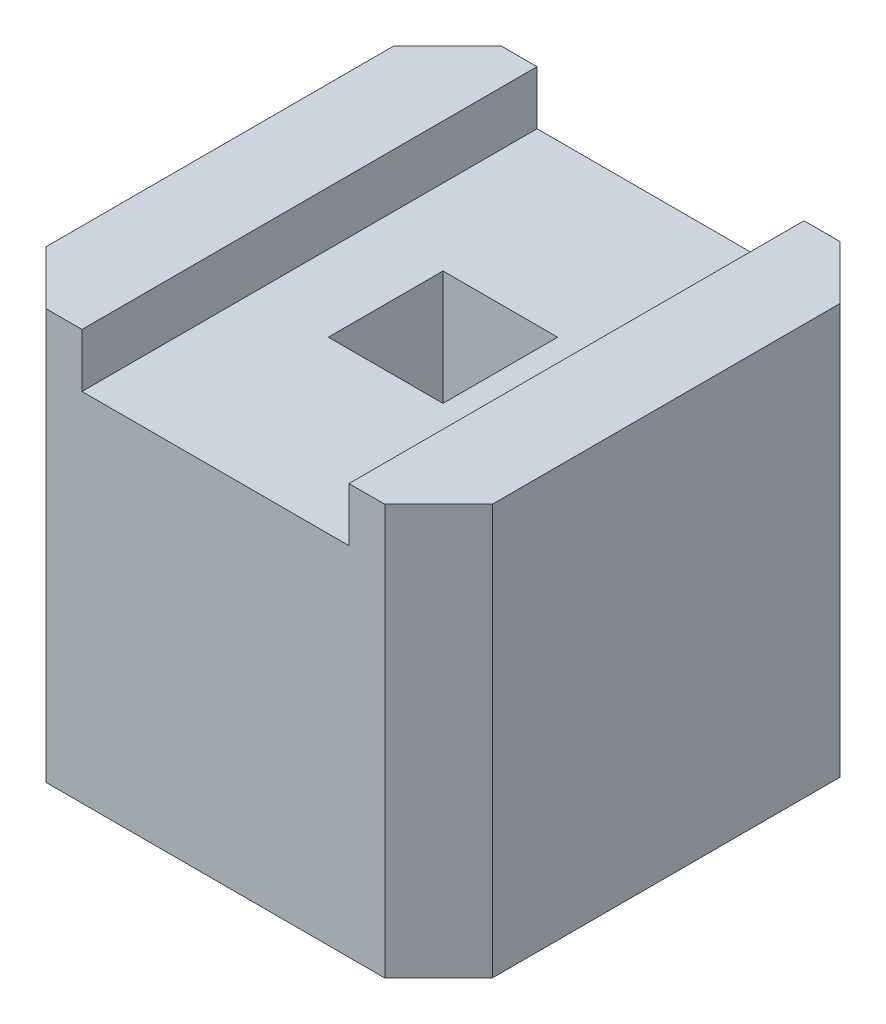
ISO-10303-21;
HEADER;
FILE_DESCRIPTION(('STEP AP214'),'2;1');
FILE_NAME('part.step','',(''),(''),'','','');
FILE_SCHEMA(('AUTOMOTIVE_DESIGN { 1 0 10303 214 1 1 1 1 }'));
ENDSEC;
DATA;
#1=APPLICATION_CONTEXT('core data for automotive mechanical design processes');
#2=APPLICATION_PROTOCOL_DEFINITION('international standard','automotive_design',2000,#1);
#3=PRODUCT_CONTEXT('',#1,'mechanical');
#4=PRODUCT('Part','Part','',(#3));
#5=PRODUCT_RELATED_PRODUCT_CATEGORY('part','',(#4));
#6=PRODUCT_DEFINITION_FORMATION('','',#4);
#7=PRODUCT_DEFINITION_CONTEXT('part definition',#1,'design');
#8=PRODUCT_DEFINITION('design','',#6,#7);
#9=PRODUCT_DEFINITION_SHAPE('','',#8);
#10=(LENGTH_UNIT() NAMED_UNIT(*) SI_UNIT(.MILLI.,.METRE.));
#11=(NAMED_UNIT(*) PLANE_ANGLE_UNIT() SI_UNIT($,.RADIAN.));
#12=(NAMED_UNIT(*) SI_UNIT($,.STERADIAN.) SOLID_ANGLE_UNIT());
#13=UNCERTAINTY_MEASURE_WITH_UNIT(LENGTH_MEASURE(1.E-05),#10,'distance_accuracy_value','');
#14=(GEOMETRIC_REPRESENTATION_CONTEXT(3) GLOBAL_UNCERTAINTY_ASSIGNED_CONTEXT((#13)) GLOBAL_UNIT_ASSIGNED_CONTEXT((#10,
#11,#12)) REPRESENTATION_CONTEXT('',''));
#15=CARTESIAN_POINT('',(0.,0.,0.));
#16=DIRECTION('',(0.,0.,1.));
#17=DIRECTION('',(1.,0.,0.));
#18=AXIS2_PLACEMENT_3D('',#15,#16,#17);
#19=CARTESIAN_POINT('',(-7.21519999999999,-2.4901999568462,8.63));
#20=DIRECTION('',(0.,0.,1.));
#21=DIRECTION('',(1.,0.,0.));
#22=AXIS2_PLACEMENT_3D('',#19,#20,#21);
#23=PLANE('',#22);
#24=DIRECTION('',(0.,1.,0.));
#25=VECTOR('',#24,1.);
#26=CARTESIAN_POINT('',(-5.90999999999999,-0.0998000169278002,8.63));
#27=LINE('',#26,#25);
#28=CARTESIAN_POINT('',(-5.90999999999999,-0.300000011921,8.63));
#29=VERTEX_POINT('',#28);
#30=CARTESIAN_POINT('',(-5.90999999999999,-2.289999961853,8.63));
#31=VERTEX_POINT('',#30);
#32=EDGE_CURVE('E165',#29,#31,#27,.F.);
#33=ORIENTED_EDGE('',*,*,#32,.F.);
#34=DIRECTION('',(1.,0.,0.));
#35=VECTOR('',#34,1.);
#36=CARTESIAN_POINT('',(-7.21519999999999,-0.300000011921,8.63));
#37=LINE('',#36,#35);
#38=CARTESIAN_POINT('',(-6.54999999999999,-0.300000011921,8.63));
#39=VERTEX_POINT('',#38);
#40=EDGE_CURVE('E140',#29,#39,#37,.F.);
#41=ORIENTED_EDGE('',*,*,#40,.T.);
#42=DIRECTION('',(0.,1.,0.));
#43=VECTOR('',#42,1.);
#44=CARTESIAN_POINT('',(-6.54999999999999,-2.4901999568462,8.63));
#45=LINE('',#44,#43);
#46=CARTESIAN_POINT('',(-6.54999999999999,-2.289999961853,8.63));
#47=VERTEX_POINT('',#46);
#48=EDGE_CURVE('E167',#47,#39,#45,.T.);
#49=ORIENTED_EDGE('',*,*,#48,.F.);
#50=DIRECTION('',(1.,0.,0.));
#51=VECTOR('',#50,1.);
#52=CARTESIAN_POINT('',(-7.21519999999999,-2.289999961853,8.63));
#53=LINE('',#52,#51);
#54=EDGE_CURVE('E20',#47,#31,#53,.T.);
#55=ORIENTED_EDGE('',*,*,#54,.T.);
#56=EDGE_LOOP('',(#33,#41,#49,#55));
#57=FACE_BOUND('',#56,.T.);
#58=ADVANCED_FACE('F17',(#57),#23,.T.);
#59=CARTESIAN_POINT('',(-6.97499999999999,0.6312000011921,10.4752));
#60=DIRECTION('',(1.,0.,0.));
#61=DIRECTION('',(0.,0.,-1.));
#62=AXIS2_PLACEMENT_3D('',#59,#60,#61);
#63=PLANE('',#62);
#64=DIRECTION('',(0.,1.,0.));
#65=VECTOR('',#64,1.);
#66=CARTESIAN_POINT('',(-6.97499999999999,0.6312000011921,7.68));
#67=LINE('',#66,#65);
#68=CARTESIAN_POINT('',(-6.97499999999999,-0.300000011921,7.68));
#69=VERTEX_POINT('',#68);
#70=CARTESIAN_POINT('',(-6.97499999999999,0.,7.68));
#71=VERTEX_POINT('',#70);
#72=EDGE_CURVE('E126',#69,#71,#67,.T.);
#73=ORIENTED_EDGE('',*,*,#72,.T.);
#74=DIRECTION('',(0.,0.,1.));
#75=VECTOR('',#74,1.);
#76=CARTESIAN_POINT('',(-6.97499999999999,0.,10.4752));
#77=LINE('',#76,#75);
#78=CARTESIAN_POINT('',(-6.97499999999999,0.,10.22));
#79=VERTEX_POINT('',#78);
#80=EDGE_CURVE('E143',#79,#71,#77,.F.);
#81=ORIENTED_EDGE('',*,*,#80,.F.);
#82=DIRECTION('',(0.,1.,0.));
#83=VECTOR('',#82,1.);
#84=CARTESIAN_POINT('',(-6.97499999999999,0.6312000011921,10.22));
#85=LINE('',#84,#83);
#86=CARTESIAN_POINT('',(-6.97499999999999,-0.300000011921,10.22));
#87=VERTEX_POINT('',#86);
#88=EDGE_CURVE('E131',#79,#87,#85,.F.);
#89=ORIENTED_EDGE('',*,*,#88,.T.);
#90=DIRECTION('',(0.,0.,1.));
#91=VECTOR('',#90,1.);
#92=CARTESIAN_POINT('',(-6.97499999999999,-0.300000011921,7.4248));
#93=LINE('',#92,#91);
#94=EDGE_CURVE('E239',#69,#87,#93,.T.);
#95=ORIENTED_EDGE('',*,*,#94,.F.);
#96=EDGE_LOOP('',(#73,#81,#89,#95));
#97=FACE_BOUND('',#96,.T.);
#98=ADVANCED_FACE('F144',(#97),#63,.T.);
#99=CARTESIAN_POINT('',(-5.48499999999999,0.6312000011921,7.4248));
#100=DIRECTION('',(-1.,0.,0.));
#101=DIRECTION('',(0.,0.,1.));
#102=AXIS2_PLACEMENT_3D('',#99,#100,#101);
#103=PLANE('',#102);
#104=DIRECTION('',(0.,1.,0.));
#105=VECTOR('',#104,1.);
#106=CARTESIAN_POINT('',(-5.48499999999999,0.6312000011921,10.22));
#107=LINE('',#106,#105);
#108=CARTESIAN_POINT('',(-5.48499999999999,-0.300000011921,10.22));
#109=VERTEX_POINT('',#108);
#110=CARTESIAN_POINT('',(-5.48499999999999,0.,10.22));
#111=VERTEX_POINT('',#110);
#112=EDGE_CURVE('E152',#109,#111,#107,.T.);
#113=ORIENTED_EDGE('',*,*,#112,.T.);
#114=DIRECTION('',(0.,0.,1.));
#115=VECTOR('',#114,1.);
#116=CARTESIAN_POINT('',(-5.48499999999999,0.,10.4752));
#117=LINE('',#116,#115);
#118=CARTESIAN_POINT('',(-5.48499999999999,0.,7.68));
#119=VERTEX_POINT('',#118);
#120=EDGE_CURVE('E196',#119,#111,#117,.T.);
#121=ORIENTED_EDGE('',*,*,#120,.F.);
#122=DIRECTION('',(0.,1.,0.));
#123=VECTOR('',#122,1.);
#124=CARTESIAN_POINT('',(-5.48499999999999,0.6312000011921,7.68));
#125=LINE('',#124,#123);
#126=CARTESIAN_POINT('',(-5.48499999999999,-0.300000011921,7.68));
#127=VERTEX_POINT('',#126);
#128=EDGE_CURVE('E154',#119,#127,#125,.F.);
#129=ORIENTED_EDGE('',*,*,#128,.T.);
#130=DIRECTION('',(0.,0.,1.));
#131=VECTOR('',#130,1.);
#132=CARTESIAN_POINT('',(-5.48499999999999,-0.300000011921,7.4248));
#133=LINE('',#132,#131);
#134=EDGE_CURVE('E236',#109,#127,#133,.F.);
#135=ORIENTED_EDGE('',*,*,#134,.F.);
#136=EDGE_LOOP('',(#113,#121,#129,#135));
#137=FACE_BOUND('',#136,.T.);
#138=ADVANCED_FACE('F328',(#137),#103,.T.);
#139=CARTESIAN_POINT('',(-8.12619999999999,0.,10.4752));
#140=DIRECTION('',(0.,1.,0.));
#141=DIRECTION('',(0.,0.,1.));
#142=AXIS2_PLACEMENT_3D('',#139,#140,#141);
#143=PLANE('',#142);
#144=ORIENTED_EDGE('',*,*,#80,.T.);
#145=DIRECTION('',(1.,0.,0.));
#146=VECTOR('',#145,1.);
#147=CARTESIAN_POINT('',(-8.12619999999999,0.,7.68));
#148=LINE('',#147,#146);
#149=CARTESIAN_POINT('',(-7.17499999999999,0.,7.68));
#150=VERTEX_POINT('',#149);
#151=EDGE_CURVE('E146',#71,#150,#148,.F.);
#152=ORIENTED_EDGE('',*,*,#151,.T.);
#153=DIRECTION('',(-0.707106781186551,0.,0.707106781186544));
#154=VECTOR('',#153,1.);
#155=CARTESIAN_POINT('',(-7.93046406871192,0.,8.43546406871191));
#156=LINE('',#155,#154);
#157=CARTESIAN_POINT('',(-7.47499999999999,0.,7.98));
#158=VERTEX_POINT('',#157);
#159=EDGE_CURVE('E199',#158,#150,#156,.F.);
#160=ORIENTED_EDGE('',*,*,#159,.F.);
#161=DIRECTION('',(0.,0.,1.));
#162=VECTOR('',#161,1.);
#163=CARTESIAN_POINT('',(-7.47499999999999,0.,10.1152));
#164=LINE('',#163,#162);
#165=CARTESIAN_POINT('',(-7.47499999999999,0.,9.92000000000001));
#166=VERTEX_POINT('',#165);
#167=EDGE_CURVE('E230',#166,#158,#164,.F.);
#168=ORIENTED_EDGE('',*,*,#167,.F.);
#169=DIRECTION('',(0.707106781186545,0.,0.70710678118655));
#170=VECTOR('',#169,1.);
#171=CARTESIAN_POINT('',(-6.71953593128807,0.,10.6754640687119));
#172=LINE('',#171,#170);
#173=CARTESIAN_POINT('',(-7.17499999999999,0.,10.22));
#174=VERTEX_POINT('',#173);
#175=EDGE_CURVE('E150',#174,#166,#172,.F.);
#176=ORIENTED_EDGE('',*,*,#175,.F.);
#177=DIRECTION('',(1.,0.,0.));
#178=VECTOR('',#177,1.);
#179=CARTESIAN_POINT('',(-8.12619999999999,0.,10.22));
#180=LINE('',#179,#178);
#181=EDGE_CURVE('E135',#174,#79,#180,.T.);
#182=ORIENTED_EDGE('',*,*,#181,.T.);
#183=EDGE_LOOP('',(#144,#152,#160,#168,#176,#182));
#184=FACE_BOUND('',#183,.T.);
#185=ADVANCED_FACE('F148',(#184),#143,.T.);
#186=CARTESIAN_POINT('',(-7.93046406871192,0.2301999961853,8.43546406871191));
#187=DIRECTION('',(-0.707106781186544,0.,-0.707106781186551));
#188=DIRECTION('',(-0.707106781186551,0.,0.707106781186544));
#189=AXIS2_PLACEMENT_3D('',#186,#187,#188);
#190=PLANE('',#189);
#191=DIRECTION('',(0.,1.,0.));
#192=VECTOR('',#191,1.);
#193=CARTESIAN_POINT('',(-7.47499999999999,-2.5201999580383,7.98));
#194=LINE('',#193,#192);
#195=CARTESIAN_POINT('',(-7.47499999999999,-2.289999961853,7.98));
#196=VERTEX_POINT('',#195);
#197=EDGE_CURVE('E212',#158,#196,#194,.F.);
#198=ORIENTED_EDGE('',*,*,#197,.F.);
#199=ORIENTED_EDGE('',*,*,#159,.T.);
#200=DIRECTION('',(0.,1.,0.));
#201=VECTOR('',#200,1.);
#202=CARTESIAN_POINT('',(-7.17499999999999,-2.5201999580383,7.68));
#203=LINE('',#202,#201);
#204=CARTESIAN_POINT('',(-7.17499999999999,-2.289999961853,7.68));
#205=VERTEX_POINT('',#204);
#206=EDGE_CURVE('E209',#205,#150,#203,.T.);
#207=ORIENTED_EDGE('',*,*,#206,.F.);
#208=DIRECTION('',(-0.707106781186551,0.,0.707106781186544));
#209=VECTOR('',#208,1.);
#210=CARTESIAN_POINT('',(-7.93046406871192,-2.289999961853,8.43546406871191));
#211=LINE('',#210,#209);
#212=EDGE_CURVE('E202',#205,#196,#211,.T.);
#213=ORIENTED_EDGE('',*,*,#212,.T.);
#214=EDGE_LOOP('',(#198,#199,#207,#213));
#215=FACE_BOUND('',#214,.T.);
#216=ADVANCED_FACE('F208',(#215),#190,.T.);
#217=CARTESIAN_POINT('',(-6.13619999999999,0.,10.4752));
#218=DIRECTION('',(0.,1.,0.));
#219=DIRECTION('',(0.,0.,1.));
#220=AXIS2_PLACEMENT_3D('',#217,#218,#219);
#221=PLANE('',#220);
#222=ORIENTED_EDGE('',*,*,#120,.T.);
#223=DIRECTION('',(1.,0.,0.));
#224=VECTOR('',#223,1.);
#225=CARTESIAN_POINT('',(-6.13619999999999,0.,10.22));
#226=LINE('',#225,#224);
#227=CARTESIAN_POINT('',(-5.28499999999999,0.,10.22));
#228=VERTEX_POINT('',#227);
#229=EDGE_CURVE('E194',#111,#228,#226,.T.);
#230=ORIENTED_EDGE('',*,*,#229,.T.);
#231=DIRECTION('',(0.707106781186551,0.,-0.707106781186544));
#232=VECTOR('',#231,1.);
#233=CARTESIAN_POINT('',(-4.52953593128806,0.,9.4645359312881));
#234=LINE('',#233,#232);
#235=CARTESIAN_POINT('',(-4.98499999999999,0.,9.92000000000001));
#236=VERTEX_POINT('',#235);
#237=EDGE_CURVE('E178',#236,#228,#234,.F.);
#238=ORIENTED_EDGE('',*,*,#237,.F.);
#239=DIRECTION('',(0.,0.,-1.));
#240=VECTOR('',#239,1.);
#241=CARTESIAN_POINT('',(-4.98499999999999,0.,10.1152));
#242=LINE('',#241,#240);
#243=CARTESIAN_POINT('',(-4.98499999999999,0.,7.98));
#244=VERTEX_POINT('',#243);
#245=EDGE_CURVE('E267',#244,#236,#242,.F.);
#246=ORIENTED_EDGE('',*,*,#245,.F.);
#247=DIRECTION('',(-0.707106781186545,0.,-0.70710678118655));
#248=VECTOR('',#247,1.);
#249=CARTESIAN_POINT('',(-5.74046406871192,0.,7.2245359312881));
#250=LINE('',#249,#248);
#251=CARTESIAN_POINT('',(-5.28499999999999,0.,7.68));
#252=VERTEX_POINT('',#251);
#253=EDGE_CURVE('E189',#252,#244,#250,.F.);
#254=ORIENTED_EDGE('',*,*,#253,.F.);
#255=DIRECTION('',(-1.,0.,0.));
#256=VECTOR('',#255,1.);
#257=CARTESIAN_POINT('',(-7.36519999999999,0.,7.68));
#258=LINE('',#257,#256);
#259=EDGE_CURVE('E223',#119,#252,#258,.F.);
#260=ORIENTED_EDGE('',*,*,#259,.F.);
#261=EDGE_LOOP('',(#222,#230,#238,#246,#254,#260));
#262=FACE_BOUND('',#261,.T.);
#263=ADVANCED_FACE('F275',(#262),#221,.T.);
#264=CARTESIAN_POINT('',(-5.74046406871192,0.2301999961853,7.2245359312881));
#265=DIRECTION('',(0.70710678118655,0.,-0.707106781186545));
#266=DIRECTION('',(-0.707106781186545,0.,-0.70710678118655));
#267=AXIS2_PLACEMENT_3D('',#264,#265,#266);
#268=PLANE('',#267);
#269=DIRECTION('',(0.,1.,0.));
#270=VECTOR('',#269,1.);
#271=CARTESIAN_POINT('',(-5.28499999999999,-2.5201999580383,7.68));
#272=LINE('',#271,#270);
#273=CARTESIAN_POINT('',(-5.285,-2.289999961853,7.68000000000001));
#274=VERTEX_POINT('',#273);
#275=EDGE_CURVE('E270',#252,#274,#272,.F.);
#276=ORIENTED_EDGE('',*,*,#275,.F.);
#277=ORIENTED_EDGE('',*,*,#253,.T.);
#278=DIRECTION('',(0.,1.,0.));
#279=VECTOR('',#278,1.);
#280=CARTESIAN_POINT('',(-4.98499999999999,0.2301999961853,7.98));
#281=LINE('',#280,#279);
#282=CARTESIAN_POINT('',(-4.985,-2.289999961853,7.98000000000001));
#283=VERTEX_POINT('',#282);
#284=EDGE_CURVE('E261',#283,#244,#281,.T.);
#285=ORIENTED_EDGE('',*,*,#284,.F.);
#286=DIRECTION('',(-0.707106781186545,0.,-0.70710678118655));
#287=VECTOR('',#286,1.);
#288=CARTESIAN_POINT('',(-5.74046406871192,-2.289999961853,7.2245359312881));
#289=LINE('',#288,#287);
#290=EDGE_CURVE('E192',#283,#274,#289,.T.);
#291=ORIENTED_EDGE('',*,*,#290,.T.);
#292=EDGE_LOOP('',(#276,#277,#285,#291));
#293=FACE_BOUND('',#292,.T.);
#294=ADVANCED_FACE('F278',(#293),#268,.T.);
#295=CARTESIAN_POINT('',(-6.71953593128807,0.2301999961853,10.6754640687119));
#296=DIRECTION('',(-0.70710678118655,0.,0.707106781186545));
#297=DIRECTION('',(0.707106781186545,0.,0.70710678118655));
#298=AXIS2_PLACEMENT_3D('',#295,#296,#297);
#299=PLANE('',#298);
#300=DIRECTION('',(0.,1.,0.));
#301=VECTOR('',#300,1.);
#302=CARTESIAN_POINT('',(-7.17499999999999,0.2301999961853,10.22));
#303=LINE('',#302,#301);
#304=CARTESIAN_POINT('',(-7.17499999999998,-2.289999961853,10.22));
#305=VERTEX_POINT('',#304);
#306=EDGE_CURVE('E259',#174,#305,#303,.F.);
#307=ORIENTED_EDGE('',*,*,#306,.F.);
#308=ORIENTED_EDGE('',*,*,#175,.T.);
#309=DIRECTION('',(0.,1.,0.));
#310=VECTOR('',#309,1.);
#311=CARTESIAN_POINT('',(-7.47499999999999,-2.5201999580383,9.92000000000001));
#312=LINE('',#311,#310);
#313=CARTESIAN_POINT('',(-7.47499999999998,-2.289999961853,9.92));
#314=VERTEX_POINT('',#313);
#315=EDGE_CURVE('E220',#314,#166,#312,.T.);
#316=ORIENTED_EDGE('',*,*,#315,.F.);
#317=DIRECTION('',(0.707106781186545,0.,0.70710678118655));
#318=VECTOR('',#317,1.);
#319=CARTESIAN_POINT('',(-6.71953593128807,-2.289999961853,10.6754640687119));
#320=LINE('',#319,#318);
#321=EDGE_CURVE('E187',#314,#305,#320,.T.);
#322=ORIENTED_EDGE('',*,*,#321,.T.);
#323=EDGE_LOOP('',(#307,#308,#316,#322));
#324=FACE_BOUND('',#323,.T.);
#325=ADVANCED_FACE('F294',(#324),#299,.T.);
#326=CARTESIAN_POINT('',(-4.52953593128806,0.2301999961853,9.4645359312881));
#327=DIRECTION('',(0.707106781186544,0.,0.707106781186551));
#328=DIRECTION('',(0.707106781186551,0.,-0.707106781186544));
#329=AXIS2_PLACEMENT_3D('',#326,#327,#328);
#330=PLANE('',#329);
#331=DIRECTION('',(0.,1.,0.));
#332=VECTOR('',#331,1.);
#333=CARTESIAN_POINT('',(-4.98499999999999,0.2301999961853,9.92000000000001));
#334=LINE('',#333,#332);
#335=CARTESIAN_POINT('',(-4.98499999999999,-2.289999961853,9.92000000000001));
#336=VERTEX_POINT('',#335);
#337=EDGE_CURVE('E264',#236,#336,#334,.F.);
#338=ORIENTED_EDGE('',*,*,#337,.F.);
#339=ORIENTED_EDGE('',*,*,#237,.T.);
#340=DIRECTION('',(0.,1.,0.));
#341=VECTOR('',#340,1.);
#342=CARTESIAN_POINT('',(-5.28499999999999,0.2301999961853,10.22));
#343=LINE('',#342,#341);
#344=CARTESIAN_POINT('',(-5.28499999999999,-2.289999961853,10.22));
#345=VERTEX_POINT('',#344);
#346=EDGE_CURVE('E253',#345,#228,#343,.T.);
#347=ORIENTED_EDGE('',*,*,#346,.F.);
#348=DIRECTION('',(0.707106781186551,0.,-0.707106781186544));
#349=VECTOR('',#348,1.);
#350=CARTESIAN_POINT('',(-4.52953593128806,-2.289999961853,9.4645359312881));
#351=LINE('',#350,#349);
#352=EDGE_CURVE('E181',#345,#336,#351,.T.);
#353=ORIENTED_EDGE('',*,*,#352,.T.);
#354=EDGE_LOOP('',(#338,#339,#347,#353));
#355=FACE_BOUND('',#354,.T.);
#356=ADVANCED_FACE('F325',(#355),#330,.T.);
#357=CARTESIAN_POINT('',(-5.90999999999999,-0.0998000169278002,9.9352));
#358=DIRECTION('',(-1.,0.,0.));
#359=DIRECTION('',(0.,0.,1.));
#360=AXIS2_PLACEMENT_3D('',#357,#358,#359);
#361=PLANE('',#360);
#362=DIRECTION('',(0.,1.,0.));
#363=VECTOR('',#362,1.);
#364=CARTESIAN_POINT('',(-5.90999999999999,-0.0998000169278002,9.27));
#365=LINE('',#364,#363);
#366=CARTESIAN_POINT('',(-5.90999999999999,-0.300000011921,9.27));
#367=VERTEX_POINT('',#366);
#368=CARTESIAN_POINT('',(-5.90999999999999,-2.289999961853,9.27));
#369=VERTEX_POINT('',#368);
#370=EDGE_CURVE('E249',#367,#369,#365,.F.);
#371=ORIENTED_EDGE('',*,*,#370,.F.);
#372=DIRECTION('',(0.,0.,1.));
#373=VECTOR('',#372,1.);
#374=CARTESIAN_POINT('',(-5.90999999999999,-0.300000011921,7.4248));
#375=LINE('',#374,#373);
#376=EDGE_CURVE('E177',#29,#367,#375,.T.);
#377=ORIENTED_EDGE('',*,*,#376,.F.);
#378=ORIENTED_EDGE('',*,*,#32,.T.);
#379=DIRECTION('',(0.,0.,1.));
#380=VECTOR('',#379,1.);
#381=CARTESIAN_POINT('',(-5.90999999999999,-2.289999961853,9.9352));
#382=LINE('',#381,#380);
#383=EDGE_CURVE('E168',#31,#369,#382,.T.);
#384=ORIENTED_EDGE('',*,*,#383,.T.);
#385=EDGE_LOOP('',(#371,#377,#378,#384));
#386=FACE_BOUND('',#385,.T.);
#387=ADVANCED_FACE('F175',(#386),#361,.T.);
#388=CARTESIAN_POINT('',(-6.54999999999999,-2.4901999568462,9.9352));
#389=DIRECTION('',(1.,0.,0.));
#390=DIRECTION('',(0.,0.,-1.));
#391=AXIS2_PLACEMENT_3D('',#388,#389,#390);
#392=PLANE('',#391);
#393=ORIENTED_EDGE('',*,*,#48,.T.);
#394=DIRECTION('',(0.,0.,1.));
#395=VECTOR('',#394,1.);
#396=CARTESIAN_POINT('',(-6.54999999999999,-0.300000011921,7.4248));
#397=LINE('',#396,#395);
#398=CARTESIAN_POINT('',(-6.54999999999999,-0.300000011921,9.27));
#399=VERTEX_POINT('',#398);
#400=EDGE_CURVE('E232',#399,#39,#397,.F.);
#401=ORIENTED_EDGE('',*,*,#400,.F.);
#402=DIRECTION('',(0.,1.,0.));
#403=VECTOR('',#402,1.);
#404=CARTESIAN_POINT('',(-6.54999999999999,-0.0998000169278002,9.27));
#405=LINE('',#404,#403);
#406=CARTESIAN_POINT('',(-6.54999999999999,-2.289999961853,9.27));
#407=VERTEX_POINT('',#406);
#408=EDGE_CURVE('E244',#407,#399,#405,.T.);
#409=ORIENTED_EDGE('',*,*,#408,.F.);
#410=DIRECTION('',(0.,0.,-1.));
#411=VECTOR('',#410,1.);
#412=CARTESIAN_POINT('',(-6.54999999999999,-2.289999961853,9.9352));
#413=LINE('',#412,#411);
#414=EDGE_CURVE('E34',#407,#47,#413,.T.);
#415=ORIENTED_EDGE('',*,*,#414,.T.);
#416=EDGE_LOOP('',(#393,#401,#409,#415));
#417=FACE_BOUND('',#416,.T.);
#418=ADVANCED_FACE('F242',(#417),#392,.T.);
#419=CARTESIAN_POINT('',(-7.12519999999999,-0.300000011921,7.4248));
#420=DIRECTION('',(0.,1.,0.));
#421=DIRECTION('',(0.,0.,1.));
#422=AXIS2_PLACEMENT_3D('',#419,#420,#421);
#423=PLANE('',#422);
#424=DIRECTION('',(-1.,0.,0.));
#425=VECTOR('',#424,1.);
#426=CARTESIAN_POINT('',(-7.21519999999999,-0.300000011921,9.27));
#427=LINE('',#426,#425);
#428=EDGE_CURVE('E248',#399,#367,#427,.F.);
#429=ORIENTED_EDGE('',*,*,#428,.F.);
#430=ORIENTED_EDGE('',*,*,#400,.T.);
#431=ORIENTED_EDGE('',*,*,#40,.F.);
#432=ORIENTED_EDGE('',*,*,#376,.T.);
#433=EDGE_LOOP('',(#429,#430,#431,#432));
#434=FACE_BOUND('',#433,.T.);
#435=ORIENTED_EDGE('',*,*,#134,.T.);
#436=DIRECTION('',(-1.,0.,0.));
#437=VECTOR('',#436,1.);
#438=CARTESIAN_POINT('',(-7.36519999999999,-0.300000011921,7.68));
#439=LINE('',#438,#437);
#440=EDGE_CURVE('E219',#69,#127,#439,.F.);
#441=ORIENTED_EDGE('',*,*,#440,.F.);
#442=ORIENTED_EDGE('',*,*,#94,.T.);
#443=DIRECTION('',(1.,0.,0.));
#444=VECTOR('',#443,1.);
#445=CARTESIAN_POINT('',(-7.3652,-0.300000011921,10.22));
#446=LINE('',#445,#444);
#447=EDGE_CURVE('E138',#109,#87,#446,.F.);
#448=ORIENTED_EDGE('',*,*,#447,.F.);
#449=EDGE_LOOP('',(#435,#441,#442,#448));
#450=FACE_BOUND('',#449,.T.);
#451=ADVANCED_FACE('F299',(#434,#450),#423,.T.);
#452=CARTESIAN_POINT('',(-7.47499999999999,-2.5201999580383,10.1152));
#453=DIRECTION('',(-1.,0.,0.));
#454=DIRECTION('',(0.,0.,1.));
#455=AXIS2_PLACEMENT_3D('',#452,#453,#454);
#456=PLANE('',#455);
#457=DIRECTION('',(0.,0.,-1.));
#458=VECTOR('',#457,1.);
#459=CARTESIAN_POINT('',(-7.47499999999999,-2.289999961853,10.4752));
#460=LINE('',#459,#458);
#461=EDGE_CURVE('E283',#314,#196,#460,.T.);
#462=ORIENTED_EDGE('',*,*,#461,.F.);
#463=ORIENTED_EDGE('',*,*,#315,.T.);
#464=ORIENTED_EDGE('',*,*,#167,.T.);
#465=ORIENTED_EDGE('',*,*,#197,.T.);
#466=EDGE_LOOP('',(#462,#463,#464,#465));
#467=FACE_BOUND('',#466,.T.);
#468=ADVANCED_FACE('F297',(#467),#456,.T.);
#469=CARTESIAN_POINT('',(-7.36519999999999,-2.5201999580383,7.68));
#470=DIRECTION('',(0.,0.,-1.));
#471=DIRECTION('',(-1.,0.,0.));
#472=AXIS2_PLACEMENT_3D('',#469,#470,#471);
#473=PLANE('',#472);
#474=ORIENTED_EDGE('',*,*,#259,.T.);
#475=ORIENTED_EDGE('',*,*,#275,.T.);
#476=DIRECTION('',(1.,0.,0.));
#477=VECTOR('',#476,1.);
#478=CARTESIAN_POINT('',(-7.72519999999999,-2.289999961853,7.68));
#479=LINE('',#478,#477);
#480=EDGE_CURVE('E218',#205,#274,#479,.T.);
#481=ORIENTED_EDGE('',*,*,#480,.F.);
#482=ORIENTED_EDGE('',*,*,#206,.T.);
#483=ORIENTED_EDGE('',*,*,#151,.F.);
#484=ORIENTED_EDGE('',*,*,#72,.F.);
#485=ORIENTED_EDGE('',*,*,#440,.T.);
#486=ORIENTED_EDGE('',*,*,#128,.F.);
#487=EDGE_LOOP('',(#474,#475,#481,#482,#483,#484,#485,#486));
#488=FACE_BOUND('',#487,.T.);
#489=ADVANCED_FACE('F215',(#488),#473,.T.);
#490=CARTESIAN_POINT('',(-4.98499999999999,0.2301999961853,10.1152));
#491=DIRECTION('',(1.,0.,0.));
#492=DIRECTION('',(0.,0.,-1.));
#493=AXIS2_PLACEMENT_3D('',#490,#491,#492);
#494=PLANE('',#493);
#495=DIRECTION('',(0.,0.,-1.));
#496=VECTOR('',#495,1.);
#497=CARTESIAN_POINT('',(-4.98499999999999,-2.289999961853,10.4752));
#498=LINE('',#497,#496);
#499=EDGE_CURVE('E281',#283,#336,#498,.F.);
#500=ORIENTED_EDGE('',*,*,#499,.F.);
#501=ORIENTED_EDGE('',*,*,#284,.T.);
#502=ORIENTED_EDGE('',*,*,#245,.T.);
#503=ORIENTED_EDGE('',*,*,#337,.T.);
#504=EDGE_LOOP('',(#500,#501,#502,#503));
#505=FACE_BOUND('',#504,.T.);
#506=ADVANCED_FACE('F306',(#505),#494,.T.);
#507=CARTESIAN_POINT('',(-7.3652,0.2301999961853,10.22));
#508=DIRECTION('',(0.,0.,1.));
#509=DIRECTION('',(1.,0.,0.));
#510=AXIS2_PLACEMENT_3D('',#507,#508,#509);
#511=PLANE('',#510);
#512=ORIENTED_EDGE('',*,*,#447,.T.);
#513=ORIENTED_EDGE('',*,*,#88,.F.);
#514=ORIENTED_EDGE('',*,*,#181,.F.);
#515=ORIENTED_EDGE('',*,*,#306,.T.);
#516=DIRECTION('',(1.,0.,0.));
#517=VECTOR('',#516,1.);
#518=CARTESIAN_POINT('',(-7.72519999999999,-2.289999961853,10.22));
#519=LINE('',#518,#517);
#520=EDGE_CURVE('E26',#345,#305,#519,.F.);
#521=ORIENTED_EDGE('',*,*,#520,.F.);
#522=ORIENTED_EDGE('',*,*,#346,.T.);
#523=ORIENTED_EDGE('',*,*,#229,.F.);
#524=ORIENTED_EDGE('',*,*,#112,.F.);
#525=EDGE_LOOP('',(#512,#513,#514,#515,#521,#522,#523,#524));
#526=FACE_BOUND('',#525,.T.);
#527=ADVANCED_FACE('F132',(#526),#511,.T.);
#528=CARTESIAN_POINT('',(-7.21519999999999,-0.0998000169278002,9.27));
#529=DIRECTION('',(0.,0.,-1.));
#530=DIRECTION('',(-1.,0.,0.));
#531=AXIS2_PLACEMENT_3D('',#528,#529,#530);
#532=PLANE('',#531);
#533=ORIENTED_EDGE('',*,*,#408,.T.);
#534=ORIENTED_EDGE('',*,*,#428,.T.);
#535=ORIENTED_EDGE('',*,*,#370,.T.);
#536=DIRECTION('',(1.,0.,0.));
#537=VECTOR('',#536,1.);
#538=CARTESIAN_POINT('',(-7.72519999999999,-2.289999961853,9.27));
#539=LINE('',#538,#537);
#540=EDGE_CURVE('E11',#407,#369,#539,.T.);
#541=ORIENTED_EDGE('',*,*,#540,.F.);
#542=EDGE_LOOP('',(#533,#534,#535,#541));
#543=FACE_BOUND('',#542,.T.);
#544=ADVANCED_FACE('F251',(#543),#532,.T.);
#545=CARTESIAN_POINT('',(-7.72519999999999,-2.289999961853,10.4752));
#546=DIRECTION('',(0.,-1.,0.));
#547=DIRECTION('',(0.,0.,-1.));
#548=AXIS2_PLACEMENT_3D('',#545,#546,#547);
#549=PLANE('',#548);
#550=ORIENTED_EDGE('',*,*,#414,.F.);
#551=ORIENTED_EDGE('',*,*,#540,.T.);
#552=ORIENTED_EDGE('',*,*,#383,.F.);
#553=ORIENTED_EDGE('',*,*,#54,.F.);
#554=EDGE_LOOP('',(#550,#551,#552,#553));
#555=FACE_BOUND('',#554,.T.);
#556=ORIENTED_EDGE('',*,*,#352,.F.);
#557=ORIENTED_EDGE('',*,*,#520,.T.);
#558=ORIENTED_EDGE('',*,*,#321,.F.);
#559=ORIENTED_EDGE('',*,*,#461,.T.);
#560=ORIENTED_EDGE('',*,*,#212,.F.);
#561=ORIENTED_EDGE('',*,*,#480,.T.);
#562=ORIENTED_EDGE('',*,*,#290,.F.);
#563=ORIENTED_EDGE('',*,*,#499,.T.);
#564=EDGE_LOOP('',(#556,#557,#558,#559,#560,#561,#562,#563));
#565=FACE_BOUND('',#564,.T.);
#566=ADVANCED_FACE('F169',(#555,#565),#549,.T.);
#567=CLOSED_SHELL('',(#58,#98,#138,#185,#216,#263,#294,#325,#356,#387,#418,#451,#468,#489,#506,
#527,#544,#566));
#568=MANIFOLD_SOLID_BREP('B1',#567);
#569=ADVANCED_BREP_SHAPE_REPRESENTATION('',(#18,#568),#14);
#570=SHAPE_DEFINITION_REPRESENTATION(#9,#569);
ENDSEC;
END-ISO-10303-21;
